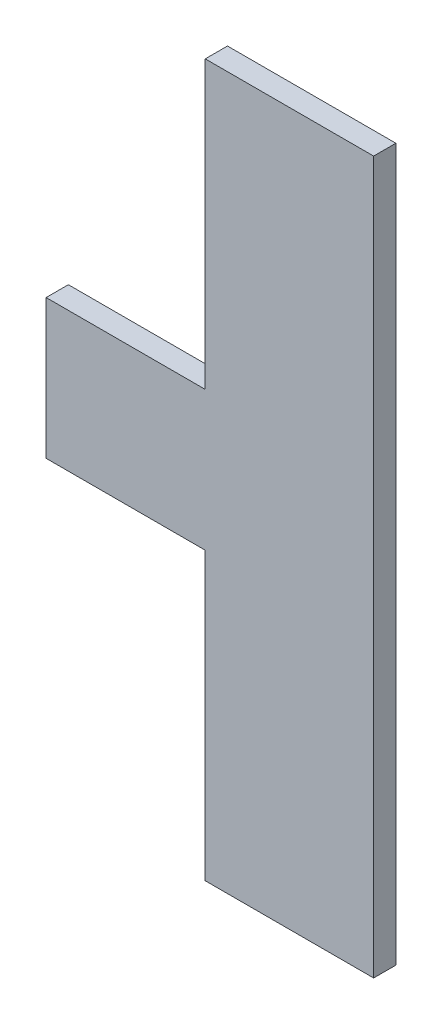
ISO-10303-21;
HEADER;
FILE_DESCRIPTION(('STEP AP214'),'2;1');
FILE_NAME('part.step','',(''),(''),'','','');
FILE_SCHEMA(('AUTOMOTIVE_DESIGN { 1 0 10303 214 1 1 1 1 }'));
ENDSEC;
DATA;
#1=APPLICATION_CONTEXT('core data for automotive mechanical design processes');
#2=APPLICATION_PROTOCOL_DEFINITION('international standard','automotive_design',2000,#1);
#3=PRODUCT_CONTEXT('',#1,'mechanical');
#4=PRODUCT('Part','Part','',(#3));
#5=PRODUCT_RELATED_PRODUCT_CATEGORY('part','',(#4));
#6=PRODUCT_DEFINITION_FORMATION('','',#4);
#7=PRODUCT_DEFINITION_CONTEXT('part definition',#1,'design');
#8=PRODUCT_DEFINITION('design','',#6,#7);
#9=PRODUCT_DEFINITION_SHAPE('','',#8);
#10=(LENGTH_UNIT() NAMED_UNIT(*) SI_UNIT(.MILLI.,.METRE.));
#11=(NAMED_UNIT(*) PLANE_ANGLE_UNIT() SI_UNIT($,.RADIAN.));
#12=(NAMED_UNIT(*) SI_UNIT($,.STERADIAN.) SOLID_ANGLE_UNIT());
#13=UNCERTAINTY_MEASURE_WITH_UNIT(LENGTH_MEASURE(1.E-05),#10,'distance_accuracy_value','');
#14=(GEOMETRIC_REPRESENTATION_CONTEXT(3) GLOBAL_UNCERTAINTY_ASSIGNED_CONTEXT((#13)) GLOBAL_UNIT_ASSIGNED_CONTEXT((#10,
#11,#12)) REPRESENTATION_CONTEXT('',''));
#15=CARTESIAN_POINT('',(0.,0.,0.));
#16=DIRECTION('',(0.,0.,1.));
#17=DIRECTION('',(1.,0.,0.));
#18=AXIS2_PLACEMENT_3D('',#15,#16,#17);
#19=CARTESIAN_POINT('',(1.6,0.8,0.));
#20=DIRECTION('',(0.,1.,0.));
#21=DIRECTION('',(1.,0.,0.));
#22=AXIS2_PLACEMENT_3D('',#19,#20,#21);
#23=PLANE('',#22);
#24=DIRECTION('',(0.,0.,-1.));
#25=VECTOR('',#24,1.);
#26=CARTESIAN_POINT('',(0.,0.80000000001,0.02500000001));
#27=LINE('',#26,#25);
#28=CARTESIAN_POINT('',(0.,0.8,0.1));
#29=VERTEX_POINT('',#28);
#30=CARTESIAN_POINT('',(0.,0.8,0.05));
#31=VERTEX_POINT('',#30);
#32=EDGE_CURVE('E11',#29,#31,#27,.T.);
#33=ORIENTED_EDGE('',*,*,#32,.F.);
#34=DIRECTION('',(-1.,0.,0.));
#35=VECTOR('',#34,1.);
#36=CARTESIAN_POINT('',(0.894631199999,0.80000000001,0.10000000001));
#37=LINE('',#36,#35);
#38=CARTESIAN_POINT('',(0.378524799956,0.8,0.1));
#39=VERTEX_POINT('',#38);
#40=EDGE_CURVE('E132',#39,#29,#37,.T.);
#41=ORIENTED_EDGE('',*,*,#40,.F.);
#42=DIRECTION('',(0.,0.,1.));
#43=VECTOR('',#42,1.);
#44=CARTESIAN_POINT('',(0.378524799966,0.80000000001,0.02500000001));
#45=LINE('',#44,#43);
#46=CARTESIAN_POINT('',(0.378524799956,0.8,0.05));
#47=VERTEX_POINT('',#46);
#48=EDGE_CURVE('E187',#47,#39,#45,.T.);
#49=ORIENTED_EDGE('',*,*,#48,.F.);
#50=DIRECTION('',(1.,0.,0.));
#51=VECTOR('',#50,1.);
#52=CARTESIAN_POINT('',(0.02500000001,0.80000000001,0.05000000001));
#53=LINE('',#52,#51);
#54=EDGE_CURVE('E166',#31,#47,#53,.T.);
#55=ORIENTED_EDGE('',*,*,#54,.F.);
#56=EDGE_LOOP('',(#33,#41,#49,#55));
#57=FACE_BOUND('',#56,.T.);
#58=ADVANCED_FACE('F17',(#57),#23,.T.);
#59=CARTESIAN_POINT('',(-1.6,-0.8,0.));
#60=DIRECTION('',(0.,-1.,0.));
#61=DIRECTION('',(0.,0.,-1.));
#62=AXIS2_PLACEMENT_3D('',#59,#60,#61);
#63=PLANE('',#62);
#64=DIRECTION('',(0.,0.,1.));
#65=VECTOR('',#64,1.);
#66=CARTESIAN_POINT('',(0.,-0.80000000001,0.02500000001));
#67=LINE('',#66,#65);
#68=CARTESIAN_POINT('',(0.,-0.8,0.05));
#69=VERTEX_POINT('',#68);
#70=CARTESIAN_POINT('',(0.,-0.8,0.1));
#71=VERTEX_POINT('',#70);
#72=EDGE_CURVE('E149',#69,#71,#67,.T.);
#73=ORIENTED_EDGE('',*,*,#72,.F.);
#74=DIRECTION('',(1.,0.,0.));
#75=VECTOR('',#74,1.);
#76=CARTESIAN_POINT('',(-1.35000000001,-0.80000000001,0.05000000001));
#77=LINE('',#76,#75);
#78=CARTESIAN_POINT('',(0.378524799956,-0.8,0.05));
#79=VERTEX_POINT('',#78);
#80=EDGE_CURVE('E119',#69,#79,#77,.T.);
#81=ORIENTED_EDGE('',*,*,#80,.T.);
#82=DIRECTION('',(0.,0.,-1.));
#83=VECTOR('',#82,1.);
#84=CARTESIAN_POINT('',(0.378524799966,-0.80000000001,0.02500000001));
#85=LINE('',#84,#83);
#86=CARTESIAN_POINT('',(0.378524799956,-0.8,0.1));
#87=VERTEX_POINT('',#86);
#88=EDGE_CURVE('E177',#87,#79,#85,.T.);
#89=ORIENTED_EDGE('',*,*,#88,.F.);
#90=DIRECTION('',(1.,0.,0.));
#91=VECTOR('',#90,1.);
#92=CARTESIAN_POINT('',(-0.705368800021,-0.80000000001,0.10000000001));
#93=LINE('',#92,#91);
#94=EDGE_CURVE('E139',#71,#87,#93,.T.);
#95=ORIENTED_EDGE('',*,*,#94,.F.);
#96=EDGE_LOOP('',(#73,#81,#89,#95));
#97=FACE_BOUND('',#96,.T.);
#98=ADVANCED_FACE('F175',(#97),#63,.T.);
#99=CARTESIAN_POINT('',(0.35764640823,0.156530962986,0.05));
#100=DIRECTION('',(0.,1.,0.));
#101=DIRECTION('',(1.,0.,0.));
#102=AXIS2_PLACEMENT_3D('',#99,#100,#101);
#103=PLANE('',#102);
#104=DIRECTION('',(0.,0.,-1.));
#105=VECTOR('',#104,1.);
#106=CARTESIAN_POINT('',(0.,0.156530962996,0.05000000001));
#107=LINE('',#106,#105);
#108=CARTESIAN_POINT('',(0.,0.156530962986,0.1));
#109=VERTEX_POINT('',#108);
#110=CARTESIAN_POINT('',(0.,0.156530962986,0.05));
#111=VERTEX_POINT('',#110);
#112=EDGE_CURVE('E26',#109,#111,#107,.T.);
#113=ORIENTED_EDGE('',*,*,#112,.T.);
#114=DIRECTION('',(-1.,0.,0.));
#115=VECTOR('',#114,1.);
#116=CARTESIAN_POINT('',(-0.596176795895,0.156530962996,0.05000000001));
#117=LINE('',#116,#115);
#118=CARTESIAN_POINT('',(-0.35764640823,0.156530962986,0.05));
#119=VERTEX_POINT('',#118);
#120=EDGE_CURVE('E65',#111,#119,#117,.T.);
#121=ORIENTED_EDGE('',*,*,#120,.T.);
#122=DIRECTION('',(0.,0.,1.));
#123=VECTOR('',#122,1.);
#124=CARTESIAN_POINT('',(-0.35764640824,0.156530962996,0.05000000001));
#125=LINE('',#124,#123);
#126=CARTESIAN_POINT('',(-0.35764640823,0.156530962986,0.1));
#127=VERTEX_POINT('',#126);
#128=EDGE_CURVE('E123',#119,#127,#125,.T.);
#129=ORIENTED_EDGE('',*,*,#128,.T.);
#130=DIRECTION('',(-1.,0.,0.));
#131=VECTOR('',#130,1.);
#132=CARTESIAN_POINT('',(-0.35764640824,0.156530962996,0.10000000001));
#133=LINE('',#132,#131);
#134=EDGE_CURVE('E121',#109,#127,#133,.T.);
#135=ORIENTED_EDGE('',*,*,#134,.F.);
#136=EDGE_LOOP('',(#113,#121,#129,#135));
#137=FACE_BOUND('',#136,.T.);
#138=ADVANCED_FACE('F122',(#137),#103,.T.);
#139=CARTESIAN_POINT('',(0.,0.8,0.05));
#140=DIRECTION('',(-1.,0.,0.));
#141=DIRECTION('',(0.,0.,1.));
#142=AXIS2_PLACEMENT_3D('',#139,#140,#141);
#143=PLANE('',#142);
#144=ORIENTED_EDGE('',*,*,#112,.F.);
#145=DIRECTION('',(0.,-1.,0.));
#146=VECTOR('',#145,1.);
#147=CARTESIAN_POINT('',(0.,0.80000000001,0.10000000001));
#148=LINE('',#147,#146);
#149=EDGE_CURVE('E114',#29,#109,#148,.T.);
#150=ORIENTED_EDGE('',*,*,#149,.F.);
#151=ORIENTED_EDGE('',*,*,#32,.T.);
#152=DIRECTION('',(0.,-1.,0.));
#153=VECTOR('',#152,1.);
#154=CARTESIAN_POINT('',(0.,0.,0.05000000001));
#155=LINE('',#154,#153);
#156=EDGE_CURVE('E117',#31,#111,#155,.T.);
#157=ORIENTED_EDGE('',*,*,#156,.T.);
#158=EDGE_LOOP('',(#144,#150,#151,#157));
#159=FACE_BOUND('',#158,.T.);
#160=ADVANCED_FACE('F112',(#159),#143,.T.);
#161=CARTESIAN_POINT('',(-0.35764640823,-0.156530962986,0.05));
#162=DIRECTION('',(0.,-1.,0.));
#163=DIRECTION('',(0.,0.,-1.));
#164=AXIS2_PLACEMENT_3D('',#161,#162,#163);
#165=PLANE('',#164);
#166=DIRECTION('',(0.,0.,1.));
#167=VECTOR('',#166,1.);
#168=CARTESIAN_POINT('',(0.,-0.156530962996,0.05000000001));
#169=LINE('',#168,#167);
#170=CARTESIAN_POINT('',(0.,-0.156530962986,0.05));
#171=VERTEX_POINT('',#170);
#172=CARTESIAN_POINT('',(0.,-0.156530962986,0.1));
#173=VERTEX_POINT('',#172);
#174=EDGE_CURVE('E148',#171,#173,#169,.T.);
#175=ORIENTED_EDGE('',*,*,#174,.T.);
#176=DIRECTION('',(1.,0.,0.));
#177=VECTOR('',#176,1.);
#178=CARTESIAN_POINT('',(0.35764640824,-0.156530962996,0.10000000001));
#179=LINE('',#178,#177);
#180=CARTESIAN_POINT('',(-0.35764640823,-0.156530962986,0.1));
#181=VERTEX_POINT('',#180);
#182=EDGE_CURVE('E155',#181,#173,#179,.T.);
#183=ORIENTED_EDGE('',*,*,#182,.F.);
#184=DIRECTION('',(0.,0.,1.));
#185=VECTOR('',#184,1.);
#186=CARTESIAN_POINT('',(-0.35764640824,-0.156530962996,0.05000000001));
#187=LINE('',#186,#185);
#188=CARTESIAN_POINT('',(-0.35764640823,-0.156530962986,0.05));
#189=VERTEX_POINT('',#188);
#190=EDGE_CURVE('E58',#189,#181,#187,.T.);
#191=ORIENTED_EDGE('',*,*,#190,.F.);
#192=DIRECTION('',(1.,0.,0.));
#193=VECTOR('',#192,1.);
#194=CARTESIAN_POINT('',(-0.953823204125,-0.156530962996,0.05000000001));
#195=LINE('',#194,#193);
#196=EDGE_CURVE('E76',#189,#171,#195,.T.);
#197=ORIENTED_EDGE('',*,*,#196,.T.);
#198=EDGE_LOOP('',(#175,#183,#191,#197));
#199=FACE_BOUND('',#198,.T.);
#200=ADVANCED_FACE('F219',(#199),#165,.T.);
#201=CARTESIAN_POINT('',(-1.55,-0.8,0.05));
#202=DIRECTION('',(0.,0.,-1.));
#203=DIRECTION('',(0.,-1.,0.));
#204=AXIS2_PLACEMENT_3D('',#201,#202,#203);
#205=PLANE('',#204);
#206=DIRECTION('',(0.,-1.,0.));
#207=VECTOR('',#206,1.);
#208=CARTESIAN_POINT('',(0.,0.,0.05000000001));
#209=LINE('',#208,#207);
#210=EDGE_CURVE('E152',#171,#69,#209,.T.);
#211=ORIENTED_EDGE('',*,*,#210,.F.);
#212=ORIENTED_EDGE('',*,*,#196,.F.);
#213=DIRECTION('',(0.,-1.,0.));
#214=VECTOR('',#213,1.);
#215=CARTESIAN_POINT('',(-0.35764640824,-0.321734518517,0.05000000001));
#216=LINE('',#215,#214);
#217=EDGE_CURVE('E143',#119,#189,#216,.T.);
#218=ORIENTED_EDGE('',*,*,#217,.F.);
#219=ORIENTED_EDGE('',*,*,#120,.F.);
#220=ORIENTED_EDGE('',*,*,#156,.F.);
#221=ORIENTED_EDGE('',*,*,#54,.T.);
#222=DIRECTION('',(0.,1.,0.));
#223=VECTOR('',#222,1.);
#224=CARTESIAN_POINT('',(0.378524799966,-0.996088091513,0.05000000001));
#225=LINE('',#224,#223);
#226=EDGE_CURVE('E181',#79,#47,#225,.T.);
#227=ORIENTED_EDGE('',*,*,#226,.F.);
#228=ORIENTED_EDGE('',*,*,#80,.F.);
#229=EDGE_LOOP('',(#211,#212,#218,#219,#220,#221,#227,#228));
#230=FACE_BOUND('',#229,.T.);
#231=ADVANCED_FACE('F182',(#230),#205,.T.);
#232=CARTESIAN_POINT('',(-0.35764640823,0.156530962986,0.05));
#233=DIRECTION('',(-1.,0.,0.));
#234=DIRECTION('',(0.,0.,1.));
#235=AXIS2_PLACEMENT_3D('',#232,#233,#234);
#236=PLANE('',#235);
#237=ORIENTED_EDGE('',*,*,#217,.T.);
#238=ORIENTED_EDGE('',*,*,#190,.T.);
#239=DIRECTION('',(0.,-1.,0.));
#240=VECTOR('',#239,1.);
#241=CARTESIAN_POINT('',(-0.35764640824,-0.156530962996,0.10000000001));
#242=LINE('',#241,#240);
#243=EDGE_CURVE('E127',#127,#181,#242,.T.);
#244=ORIENTED_EDGE('',*,*,#243,.F.);
#245=ORIENTED_EDGE('',*,*,#128,.F.);
#246=EDGE_LOOP('',(#237,#238,#244,#245));
#247=FACE_BOUND('',#246,.T.);
#248=ADVANCED_FACE('F209',(#247),#236,.T.);
#249=CARTESIAN_POINT('',(0.189262399978,-0.196088091503,0.1));
#250=DIRECTION('',(0.,0.,1.));
#251=DIRECTION('',(1.,0.,0.));
#252=AXIS2_PLACEMENT_3D('',#249,#250,#251);
#253=PLANE('',#252);
#254=ORIENTED_EDGE('',*,*,#94,.T.);
#255=DIRECTION('',(0.,1.,0.));
#256=VECTOR('',#255,1.);
#257=CARTESIAN_POINT('',(0.378524799966,-1.192176183017,0.10000000001));
#258=LINE('',#257,#256);
#259=EDGE_CURVE('E191',#87,#39,#258,.T.);
#260=ORIENTED_EDGE('',*,*,#259,.T.);
#261=ORIENTED_EDGE('',*,*,#40,.T.);
#262=ORIENTED_EDGE('',*,*,#149,.T.);
#263=ORIENTED_EDGE('',*,*,#134,.T.);
#264=ORIENTED_EDGE('',*,*,#243,.T.);
#265=ORIENTED_EDGE('',*,*,#182,.T.);
#266=DIRECTION('',(0.,-1.,0.));
#267=VECTOR('',#266,1.);
#268=CARTESIAN_POINT('',(0.,0.80000000001,0.10000000001));
#269=LINE('',#268,#267);
#270=EDGE_CURVE('E145',#173,#71,#269,.T.);
#271=ORIENTED_EDGE('',*,*,#270,.T.);
#272=EDGE_LOOP('',(#254,#260,#261,#262,#263,#264,#265,#271));
#273=FACE_BOUND('',#272,.T.);
#274=ADVANCED_FACE('F130',(#273),#253,.T.);
#275=CARTESIAN_POINT('',(0.,0.8,0.05));
#276=DIRECTION('',(-1.,0.,0.));
#277=DIRECTION('',(0.,0.,1.));
#278=AXIS2_PLACEMENT_3D('',#275,#276,#277);
#279=PLANE('',#278);
#280=ORIENTED_EDGE('',*,*,#72,.T.);
#281=ORIENTED_EDGE('',*,*,#270,.F.);
#282=ORIENTED_EDGE('',*,*,#174,.F.);
#283=ORIENTED_EDGE('',*,*,#210,.T.);
#284=EDGE_LOOP('',(#280,#281,#282,#283));
#285=FACE_BOUND('',#284,.T.);
#286=ADVANCED_FACE('F217',(#285),#279,.T.);
#287=CARTESIAN_POINT('',(0.378524799956,-1.192176183007,0.05));
#288=DIRECTION('',(1.,0.,0.));
#289=DIRECTION('',(0.,1.,0.));
#290=AXIS2_PLACEMENT_3D('',#287,#288,#289);
#291=PLANE('',#290);
#292=ORIENTED_EDGE('',*,*,#88,.T.);
#293=ORIENTED_EDGE('',*,*,#226,.T.);
#294=ORIENTED_EDGE('',*,*,#48,.T.);
#295=ORIENTED_EDGE('',*,*,#259,.F.);
#296=EDGE_LOOP('',(#292,#293,#294,#295));
#297=FACE_BOUND('',#296,.T.);
#298=ADVANCED_FACE('F190',(#297),#291,.T.);
#299=CLOSED_SHELL('',(#58,#98,#138,#160,#200,#231,#248,#274,#286,#298));
#300=MANIFOLD_SOLID_BREP('B1',#299);
#301=ADVANCED_BREP_SHAPE_REPRESENTATION('',(#18,#300),#14);
#302=SHAPE_DEFINITION_REPRESENTATION(#9,#301);
ENDSEC;
END-ISO-10303-21;
